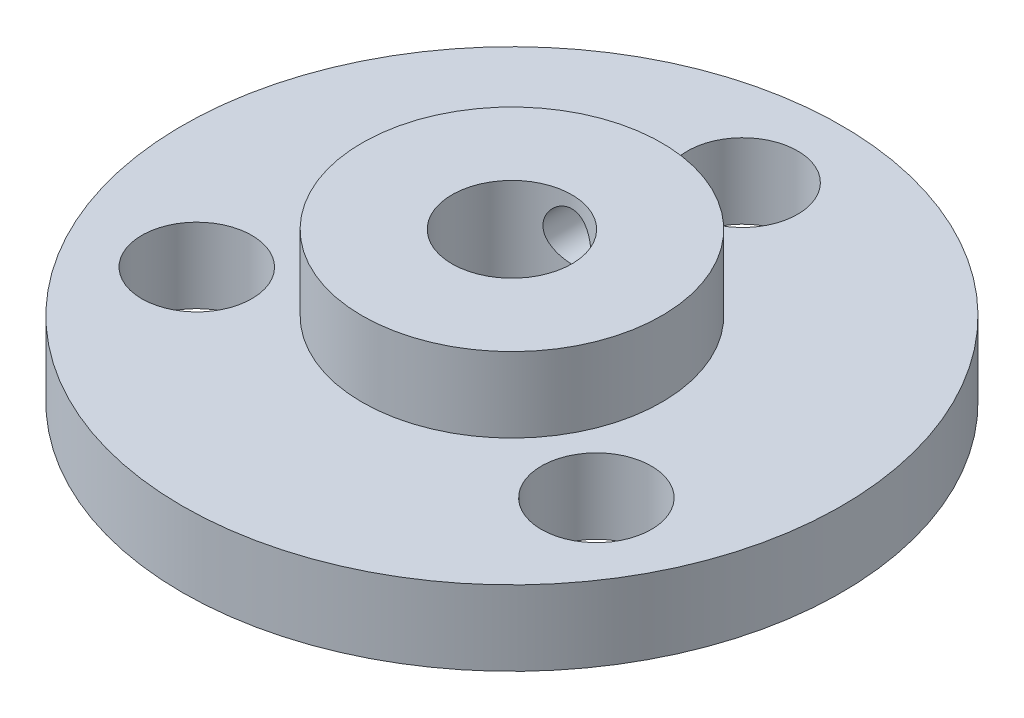
ISO-10303-21;
HEADER;
FILE_DESCRIPTION(('STEP AP214'),'2;1');
FILE_NAME('part.step','',(''),(''),'','','');
FILE_SCHEMA(('AUTOMOTIVE_DESIGN { 1 0 10303 214 1 1 1 1 }'));
ENDSEC;
DATA;
#1=APPLICATION_CONTEXT('core data for automotive mechanical design processes');
#2=APPLICATION_PROTOCOL_DEFINITION('international standard','automotive_design',2000,#1);
#3=PRODUCT_CONTEXT('',#1,'mechanical');
#4=PRODUCT('Part','Part','',(#3));
#5=PRODUCT_RELATED_PRODUCT_CATEGORY('part','',(#4));
#6=PRODUCT_DEFINITION_FORMATION('','',#4);
#7=PRODUCT_DEFINITION_CONTEXT('part definition',#1,'design');
#8=PRODUCT_DEFINITION('design','',#6,#7);
#9=PRODUCT_DEFINITION_SHAPE('','',#8);
#10=(LENGTH_UNIT() NAMED_UNIT(*) SI_UNIT(.MILLI.,.METRE.));
#11=(NAMED_UNIT(*) PLANE_ANGLE_UNIT() SI_UNIT($,.RADIAN.));
#12=(NAMED_UNIT(*) SI_UNIT($,.STERADIAN.) SOLID_ANGLE_UNIT());
#13=UNCERTAINTY_MEASURE_WITH_UNIT(LENGTH_MEASURE(1.E-05),#10,'distance_accuracy_value','');
#14=(GEOMETRIC_REPRESENTATION_CONTEXT(3) GLOBAL_UNCERTAINTY_ASSIGNED_CONTEXT((#13)) GLOBAL_UNIT_ASSIGNED_CONTEXT((#10,
#11,#12)) REPRESENTATION_CONTEXT('',''));
#15=CARTESIAN_POINT('',(0.,0.,0.));
#16=DIRECTION('',(0.,0.,1.));
#17=DIRECTION('',(1.,0.,0.));
#18=AXIS2_PLACEMENT_3D('',#15,#16,#17);
#19=CARTESIAN_POINT('',(0.,2.5,0.));
#20=DIRECTION('',(0.,1.,0.));
#21=DIRECTION('',(0.,0.,1.));
#22=AXIS2_PLACEMENT_3D('',#19,#20,#21);
#23=PLANE('',#22);
#24=CARTESIAN_POINT('',(0.,2.5,0.));
#25=DIRECTION('',(0.,1.,0.));
#26=DIRECTION('',(0.,0.,1.));
#27=AXIS2_PLACEMENT_3D('',#24,#25,#26);
#28=CIRCLE('',#27,11.);
#29=CARTESIAN_POINT('',(0.,2.5,11.));
#30=VERTEX_POINT('',#29);
#31=EDGE_CURVE('E10',#30,#30,#28,.T.);
#32=ORIENTED_EDGE('',*,*,#31,.T.);
#33=EDGE_LOOP('',(#32));
#34=FACE_BOUND('',#33,.T.);
#35=CARTESIAN_POINT('',(0.,2.5,-7.7));
#36=DIRECTION('',(0.,1.,0.));
#37=DIRECTION('',(0.,0.,1.));
#38=AXIS2_PLACEMENT_3D('',#35,#36,#37);
#39=CIRCLE('',#38,1.83552150537951);
#40=CARTESIAN_POINT('',(0.,2.5,-5.86447849462049));
#41=VERTEX_POINT('',#40);
#42=EDGE_CURVE('E44',#41,#41,#39,.T.);
#43=ORIENTED_EDGE('',*,*,#42,.F.);
#44=EDGE_LOOP('',(#43));
#45=FACE_BOUND('',#44,.T.);
#46=CARTESIAN_POINT('',(6.66839560914018,2.5,3.85));
#47=DIRECTION('',(0.,1.,0.));
#48=DIRECTION('',(0.,0.,1.));
#49=AXIS2_PLACEMENT_3D('',#46,#47,#48);
#50=CIRCLE('',#49,1.83552150537951);
#51=CARTESIAN_POINT('',(6.66839560914018,2.5,5.6855215053795));
#52=VERTEX_POINT('',#51);
#53=EDGE_CURVE('E50',#52,#52,#50,.T.);
#54=ORIENTED_EDGE('',*,*,#53,.F.);
#55=EDGE_LOOP('',(#54));
#56=FACE_BOUND('',#55,.T.);
#57=CARTESIAN_POINT('',(-6.66839560914018,2.5,3.85));
#58=DIRECTION('',(0.,1.,0.));
#59=DIRECTION('',(0.,0.,1.));
#60=AXIS2_PLACEMENT_3D('',#57,#58,#59);
#61=CIRCLE('',#60,1.83552150537951);
#62=CARTESIAN_POINT('',(-6.66839560914018,2.5,5.68552150537951));
#63=VERTEX_POINT('',#62);
#64=EDGE_CURVE('E56',#63,#63,#61,.T.);
#65=ORIENTED_EDGE('',*,*,#64,.F.);
#66=EDGE_LOOP('',(#65));
#67=FACE_BOUND('',#66,.T.);
#68=CARTESIAN_POINT('',(0.,2.5,0.));
#69=DIRECTION('',(0.,1.,0.));
#70=DIRECTION('',(0.,0.,1.));
#71=AXIS2_PLACEMENT_3D('',#68,#69,#70);
#72=CIRCLE('',#71,5.);
#73=CARTESIAN_POINT('',(0.,2.5,5.));
#74=VERTEX_POINT('',#73);
#75=EDGE_CURVE('E62',#74,#74,#72,.T.);
#76=ORIENTED_EDGE('',*,*,#75,.F.);
#77=EDGE_LOOP('',(#76));
#78=FACE_BOUND('',#77,.T.);
#79=ADVANCED_FACE('F31',(#34,#45,#56,#67,#78),#23,.T.);
#80=CARTESIAN_POINT('',(0.,2.5,0.));
#81=DIRECTION('',(0.,-1.,0.));
#82=DIRECTION('',(0.,0.,-1.));
#83=AXIS2_PLACEMENT_3D('',#80,#81,#82);
#84=CYLINDRICAL_SURFACE('',#83,11.);
#85=ORIENTED_EDGE('',*,*,#31,.F.);
#86=EDGE_LOOP('',(#85));
#87=FACE_BOUND('',#86,.T.);
#88=CARTESIAN_POINT('',(0.,0.,0.));
#89=DIRECTION('',(0.,1.,0.));
#90=DIRECTION('',(0.,0.,1.));
#91=AXIS2_PLACEMENT_3D('',#88,#89,#90);
#92=CIRCLE('',#91,11.);
#93=CARTESIAN_POINT('',(0.,0.,11.));
#94=VERTEX_POINT('',#93);
#95=EDGE_CURVE('E35',#94,#94,#92,.T.);
#96=ORIENTED_EDGE('',*,*,#95,.T.);
#97=EDGE_LOOP('',(#96));
#98=FACE_BOUND('',#97,.T.);
#99=ADVANCED_FACE('F33',(#87,#98),#84,.T.);
#100=CARTESIAN_POINT('',(0.,0.,0.));
#101=DIRECTION('',(0.,1.,0.));
#102=DIRECTION('',(0.,0.,1.));
#103=AXIS2_PLACEMENT_3D('',#100,#101,#102);
#104=PLANE('',#103);
#105=CARTESIAN_POINT('',(0.,0.,0.));
#106=DIRECTION('',(0.,1.,0.));
#107=DIRECTION('',(0.,0.,1.));
#108=AXIS2_PLACEMENT_3D('',#105,#106,#107);
#109=CIRCLE('',#108,2.);
#110=CARTESIAN_POINT('',(0.,0.,2.));
#111=VERTEX_POINT('',#110);
#112=EDGE_CURVE('E65',#111,#111,#109,.T.);
#113=ORIENTED_EDGE('',*,*,#112,.T.);
#114=EDGE_LOOP('',(#113));
#115=FACE_BOUND('',#114,.T.);
#116=CARTESIAN_POINT('',(-6.66839560914018,0.,3.85));
#117=DIRECTION('',(0.,1.,0.));
#118=DIRECTION('',(0.,0.,1.));
#119=AXIS2_PLACEMENT_3D('',#116,#117,#118);
#120=CIRCLE('',#119,1.83552150537951);
#121=CARTESIAN_POINT('',(-6.66839560914018,0.,5.68552150537951));
#122=VERTEX_POINT('',#121);
#123=EDGE_CURVE('E53',#122,#122,#120,.T.);
#124=ORIENTED_EDGE('',*,*,#123,.T.);
#125=EDGE_LOOP('',(#124));
#126=FACE_BOUND('',#125,.T.);
#127=CARTESIAN_POINT('',(6.66839560914018,0.,3.85));
#128=DIRECTION('',(0.,1.,0.));
#129=DIRECTION('',(0.,0.,1.));
#130=AXIS2_PLACEMENT_3D('',#127,#128,#129);
#131=CIRCLE('',#130,1.83552150537951);
#132=CARTESIAN_POINT('',(6.66839560914018,0.,5.6855215053795));
#133=VERTEX_POINT('',#132);
#134=EDGE_CURVE('E47',#133,#133,#131,.T.);
#135=ORIENTED_EDGE('',*,*,#134,.T.);
#136=EDGE_LOOP('',(#135));
#137=FACE_BOUND('',#136,.T.);
#138=CARTESIAN_POINT('',(0.,0.,-7.7));
#139=DIRECTION('',(0.,1.,0.));
#140=DIRECTION('',(0.,0.,1.));
#141=AXIS2_PLACEMENT_3D('',#138,#139,#140);
#142=CIRCLE('',#141,1.83552150537951);
#143=CARTESIAN_POINT('',(0.,0.,-5.86447849462049));
#144=VERTEX_POINT('',#143);
#145=EDGE_CURVE('E42',#144,#144,#142,.T.);
#146=ORIENTED_EDGE('',*,*,#145,.T.);
#147=EDGE_LOOP('',(#146));
#148=FACE_BOUND('',#147,.T.);
#149=ORIENTED_EDGE('',*,*,#95,.F.);
#150=EDGE_LOOP('',(#149));
#151=FACE_BOUND('',#150,.T.);
#152=ADVANCED_FACE('F113',(#115,#126,#137,#148,#151),#104,.F.);
#153=CARTESIAN_POINT('',(0.,0.,-7.7));
#154=DIRECTION('',(0.,1.,0.));
#155=DIRECTION('',(0.,0.,1.));
#156=AXIS2_PLACEMENT_3D('',#153,#154,#155);
#157=CYLINDRICAL_SURFACE('',#156,1.83552150537951);
#158=ORIENTED_EDGE('',*,*,#145,.F.);
#159=EDGE_LOOP('',(#158));
#160=FACE_BOUND('',#159,.T.);
#161=ORIENTED_EDGE('',*,*,#42,.T.);
#162=EDGE_LOOP('',(#161));
#163=FACE_BOUND('',#162,.T.);
#164=ADVANCED_FACE('F117',(#160,#163),#157,.F.);
#165=CARTESIAN_POINT('',(6.66839560914018,0.,3.85));
#166=DIRECTION('',(0.,1.,0.));
#167=DIRECTION('',(0.,0.,1.));
#168=AXIS2_PLACEMENT_3D('',#165,#166,#167);
#169=CYLINDRICAL_SURFACE('',#168,1.83552150537951);
#170=ORIENTED_EDGE('',*,*,#134,.F.);
#171=EDGE_LOOP('',(#170));
#172=FACE_BOUND('',#171,.T.);
#173=ORIENTED_EDGE('',*,*,#53,.T.);
#174=EDGE_LOOP('',(#173));
#175=FACE_BOUND('',#174,.T.);
#176=ADVANCED_FACE('F124',(#172,#175),#169,.F.);
#177=CARTESIAN_POINT('',(-6.66839560914018,0.,3.85));
#178=DIRECTION('',(0.,1.,0.));
#179=DIRECTION('',(0.,0.,1.));
#180=AXIS2_PLACEMENT_3D('',#177,#178,#179);
#181=CYLINDRICAL_SURFACE('',#180,1.83552150537951);
#182=ORIENTED_EDGE('',*,*,#123,.F.);
#183=EDGE_LOOP('',(#182));
#184=FACE_BOUND('',#183,.T.);
#185=ORIENTED_EDGE('',*,*,#64,.T.);
#186=EDGE_LOOP('',(#185));
#187=FACE_BOUND('',#186,.T.);
#188=ADVANCED_FACE('F104',(#184,#187),#181,.F.);
#189=CARTESIAN_POINT('',(0.,5.,0.));
#190=DIRECTION('',(0.,-1.,0.));
#191=DIRECTION('',(0.,0.,-1.));
#192=AXIS2_PLACEMENT_3D('',#189,#190,#191);
#193=CYLINDRICAL_SURFACE('',#192,5.);
#194=CARTESIAN_POINT('',(0.,4.59295521709407,-5.));
#195=CARTESIAN_POINT('',(-0.0446345464348313,4.59280840972482,-4.99999925421206));
#196=CARTESIAN_POINT('',(-0.0892819443510236,4.58891705369241,-4.9993960875234));
#197=CARTESIAN_POINT('',(-0.177301891678727,4.57375034444031,-4.99704993433986));
#198=CARTESIAN_POINT('',(-0.220673197606511,4.56246802289333,-4.99530587219164));
#199=CARTESIAN_POINT('',(-0.304854977903621,4.53286726162525,-4.99087558705497));
#200=CARTESIAN_POINT('',(-0.345667459361669,4.51455441889718,-4.98819011367073));
#201=CARTESIAN_POINT('',(-0.423635297501165,4.47142634078325,-4.98217463731942));
#202=CARTESIAN_POINT('',(-0.460791109846799,4.44661191698615,-4.97884471481213));
#203=CARTESIAN_POINT('',(-0.530725668288752,4.39095066663555,-4.97187860497349));
#204=CARTESIAN_POINT('',(-0.563467348194362,4.36005754142335,-4.96824019736804));
#205=CARTESIAN_POINT('',(-0.623325168104827,4.29321676146511,-4.96108624127247));
#206=CARTESIAN_POINT('',(-0.650440971001116,4.25726880404452,-4.95757070015512));
#207=CARTESIAN_POINT('',(-0.698418461816588,4.18109293926852,-4.95104061891818));
#208=CARTESIAN_POINT('',(-0.719244831066632,4.1408425198778,-4.94802894895029));
#209=CARTESIAN_POINT('',(-0.753826505269504,4.0573583918758,-4.9428790397377));
#210=CARTESIAN_POINT('',(-0.767582254949818,4.01412487108954,-4.94074074556118));
#211=CARTESIAN_POINT('',(-0.787517076477999,3.92629609351829,-4.93760253956309));
#212=CARTESIAN_POINT('',(-0.793760297058806,3.88171574712982,-4.93659299479914));
#213=CARTESIAN_POINT('',(-0.798690889447801,3.79212975820018,-4.93579776042976));
#214=CARTESIAN_POINT('',(-0.797378748811143,3.74712414328914,-4.9360119918528));
#215=CARTESIAN_POINT('',(-0.787288858704422,3.65841063797979,-4.93763113481972));
#216=CARTESIAN_POINT('',(-0.778581283745989,3.61469453280229,-4.93902485388638));
#217=CARTESIAN_POINT('',(-0.754056623447387,3.52935153996084,-4.94282826426096));
#218=CARTESIAN_POINT('',(-0.738239305621578,3.48772472066515,-4.94523798879167));
#219=CARTESIAN_POINT('',(-0.699868024192291,3.40752234623805,-4.95081411790351));
#220=CARTESIAN_POINT('',(-0.677283485215563,3.36896166684933,-4.95398394347471));
#221=CARTESIAN_POINT('',(-0.626041212269111,3.29614996590887,-4.9607195182505));
#222=CARTESIAN_POINT('',(-0.597383026549829,3.26189926522965,-4.96428529689616));
#223=CARTESIAN_POINT('',(-0.534418967683772,3.19827161328361,-4.97145948250141));
#224=CARTESIAN_POINT('',(-0.500052548802766,3.16895454552508,-4.97506791289197));
#225=CARTESIAN_POINT('',(-0.426855352339007,3.11649466439161,-4.98188150665978));
#226=CARTESIAN_POINT('',(-0.388024554815837,3.09335187859599,-4.98508666823568));
#227=CARTESIAN_POINT('',(-0.306953152851498,3.05389666610304,-4.99073439993172));
#228=CARTESIAN_POINT('',(-0.264710579067382,3.03758821841366,-4.99317652559617));
#229=CARTESIAN_POINT('',(-0.178038476907493,3.01231358506911,-4.99701733008075));
#230=CARTESIAN_POINT('',(-0.133609117789079,3.00334683211061,-4.99841608952256));
#231=CARTESIAN_POINT('',(-0.0443428342577001,2.99308885599946,-5.00000045238604));
#232=CARTESIAN_POINT('',(0.000484388161034169,2.99171513888676,-5.00019909658237));
#233=CARTESIAN_POINT('',(0.0897277032897241,2.99646392886732,-4.99939398406668));
#234=CARTESIAN_POINT('',(0.134143810122924,3.00258617747796,-4.99839026881552));
#235=CARTESIAN_POINT('',(0.221058825336589,3.02208504347062,-4.99529929653219));
#236=CARTESIAN_POINT('',(0.263566806501661,3.03542223188221,-4.99321793138338));
#237=CARTESIAN_POINT('',(0.345743289629186,3.06893109522977,-4.98820186778873));
#238=CARTESIAN_POINT('',(0.385411640694736,3.08910313304105,-4.98526712403657));
#239=CARTESIAN_POINT('',(0.461145134721012,3.13590295965188,-4.97883553280157));
#240=CARTESIAN_POINT('',(0.49717764390488,3.16258293348531,-4.97533422270727));
#241=CARTESIAN_POINT('',(0.564283089849037,3.22156791963512,-4.9681712513089));
#242=CARTESIAN_POINT('',(0.595355698403196,3.25387330390017,-4.9645095794138));
#243=CARTESIAN_POINT('',(0.651957795364863,3.3235577117943,-4.9573959412819));
#244=CARTESIAN_POINT('',(0.677432262603723,3.36098169719568,-4.95394627756548));
#245=CARTESIAN_POINT('',(0.721732833216668,3.43962673186726,-4.9476867714127));
#246=CARTESIAN_POINT('',(0.740559142226738,3.48084766364334,-4.94487690918741));
#247=CARTESIAN_POINT('',(0.770943170127823,3.56575058190925,-4.94023112007101));
#248=CARTESIAN_POINT('',(0.782530149288911,3.60942187342313,-4.93839127728325));
#249=CARTESIAN_POINT('',(0.79819980367199,3.69812236414841,-4.93588301608632));
#250=CARTESIAN_POINT('',(0.802283073557574,3.74315145546765,-4.93521450485016));
#251=CARTESIAN_POINT('',(0.802815962429541,3.83273817599765,-4.93512779371066));
#252=CARTESIAN_POINT('',(0.799352463469276,3.87729529912648,-4.93569536340789));
#253=CARTESIAN_POINT('',(0.78507589069214,3.96518430315666,-4.93798615841887));
#254=CARTESIAN_POINT('',(0.774262828172742,4.00851618594129,-4.93970938195619));
#255=CARTESIAN_POINT('',(0.745624187596046,4.09270216575181,-4.94411292837317));
#256=CARTESIAN_POINT('',(0.727804436540425,4.1335582892027,-4.94679245578731));
#257=CARTESIAN_POINT('',(0.685666554935631,4.21171525048427,-4.9528085340871));
#258=CARTESIAN_POINT('',(0.661348141854866,4.24901593364528,-4.95614511353666));
#259=CARTESIAN_POINT('',(0.606587081465107,4.3194447098727,-4.96314620762862));
#260=CARTESIAN_POINT('',(0.57608008604431,4.3525224588935,-4.9668139223735));
#261=CARTESIAN_POINT('',(0.509945409149719,4.41311877418437,-4.97403858748415));
#262=CARTESIAN_POINT('',(0.474316548786263,4.44063605709539,-4.97759551211962));
#263=CARTESIAN_POINT('',(0.398688189514482,4.48948390134341,-4.98422474154444));
#264=CARTESIAN_POINT('',(0.358663017320111,4.51077513877548,-4.98729391237595));
#265=CARTESIAN_POINT('',(0.275572401990428,4.54629917536374,-4.99257309312883));
#266=CARTESIAN_POINT('',(0.232510090751464,4.56053912765659,-4.9947839732444));
#267=CARTESIAN_POINT('',(0.157722389070857,4.57841711433274,-4.99760747858701));
#268=CARTESIAN_POINT('',(0.126447109545309,4.58395060419822,-4.99850013479712));
#269=CARTESIAN_POINT('',(0.0634500468027397,4.59127180597416,-4.99969665612681));
#270=CARTESIAN_POINT('',(0.0317282703374389,4.59305957446456,-5.00000053014007));
#271=CARTESIAN_POINT('',(0.,4.59295521709407,-5.));
#272=B_SPLINE_CURVE_WITH_KNOTS('',3,(#194,#195,#196,#197,#198,#199,#200,#201,#202,#203,#204,
#205,#206,#207,#208,#209,#210,#211,#212,#213,#214,#215,#216,#217,#218,#219,#220,#221,#222,#223,
#224,#225,#226,#227,#228,#229,#230,#231,#232,#233,#234,#235,#236,#237,#238,#239,#240,#241,#242,
#243,#244,#245,#246,#247,#248,#249,#250,#251,#252,#253,#254,#255,#256,#257,#258,#259,#260,#261,
#262,#263,#264,#265,#266,#267,#268,#269,#270,#271),.UNSPECIFIED.,.T.,.F.,(4,2,2,2,2,2,2,2,2,2,2,
2,2,2,2,2,2,2,2,2,2,2,2,2,2,2,2,2,2,2,2,2,2,2,2,2,2,2,4),(0.,0.133788385130539,
0.267703090104946,0.401511406008692,0.535303026646016,0.670156140567426,0.805017332699408,
0.940622335585652,1.07621880815101,1.21064902767122,1.34507057236968,1.47823067492862,
1.61139513208442,1.7451705597479,1.87895594093932,2.01426343587848,2.14957153520019,
2.28495830293327,2.42033460814823,2.55423719337488,2.68813516138254,2.82130867464517,
2.95448925945418,3.08877506801445,3.22306975884365,3.3586305509906,3.49418714970257,
3.62919224330303,3.7641866373849,3.8976351294267,4.03108341633699,4.16442095702508,
4.29776429555247,4.43257259927336,4.56741198138658,4.70308547687105,4.83862105572563,
4.933725375399,5.02882825849044),.UNSPECIFIED.);
#273=CARTESIAN_POINT('',(0.,4.59295521709407,-5.));
#274=VERTEX_POINT('',#273);
#275=EDGE_CURVE('E73',#274,#274,#272,.T.);
#276=ORIENTED_EDGE('',*,*,#275,.T.);
#277=EDGE_LOOP('',(#276));
#278=FACE_BOUND('',#277,.T.);
#279=CARTESIAN_POINT('',(0.,5.,0.));
#280=DIRECTION('',(0.,1.,0.));
#281=DIRECTION('',(0.,0.,1.));
#282=AXIS2_PLACEMENT_3D('',#279,#280,#281);
#283=CIRCLE('',#282,5.);
#284=CARTESIAN_POINT('',(0.,5.,5.));
#285=VERTEX_POINT('',#284);
#286=EDGE_CURVE('E59',#285,#285,#283,.T.);
#287=ORIENTED_EDGE('',*,*,#286,.F.);
#288=EDGE_LOOP('',(#287));
#289=FACE_BOUND('',#288,.T.);
#290=ORIENTED_EDGE('',*,*,#75,.T.);
#291=EDGE_LOOP('',(#290));
#292=FACE_BOUND('',#291,.T.);
#293=ADVANCED_FACE('F84',(#278,#289,#292),#193,.T.);
#294=CARTESIAN_POINT('',(0.,5.,0.));
#295=DIRECTION('',(0.,1.,0.));
#296=DIRECTION('',(0.,0.,1.));
#297=AXIS2_PLACEMENT_3D('',#294,#295,#296);
#298=PLANE('',#297);
#299=CARTESIAN_POINT('',(0.,5.,0.));
#300=DIRECTION('',(0.,1.,0.));
#301=DIRECTION('',(0.,0.,1.));
#302=AXIS2_PLACEMENT_3D('',#299,#300,#301);
#303=CIRCLE('',#302,2.);
#304=CARTESIAN_POINT('',(0.,5.,2.));
#305=VERTEX_POINT('',#304);
#306=EDGE_CURVE('E70',#305,#305,#303,.T.);
#307=ORIENTED_EDGE('',*,*,#306,.F.);
#308=EDGE_LOOP('',(#307));
#309=FACE_BOUND('',#308,.T.);
#310=ORIENTED_EDGE('',*,*,#286,.T.);
#311=EDGE_LOOP('',(#310));
#312=FACE_BOUND('',#311,.T.);
#313=ADVANCED_FACE('F97',(#309,#312),#298,.T.);
#314=CARTESIAN_POINT('',(0.,-0.5,0.));
#315=DIRECTION('',(0.,1.,0.));
#316=DIRECTION('',(0.,0.,1.));
#317=AXIS2_PLACEMENT_3D('',#314,#315,#316);
#318=CYLINDRICAL_SURFACE('',#317,2.);
#319=CARTESIAN_POINT('',(-0.799047163232813,3.79295943814312,-1.83344583528655));
#320=CARTESIAN_POINT('',(-0.799042462665124,3.83581523738308,-1.83345016148734));
#321=CARTESIAN_POINT('',(-0.795582298961543,3.878731652025,-1.83496816656248));
#322=CARTESIAN_POINT('',(-0.781870924640436,3.96333337129395,-1.84085028760058));
#323=CARTESIAN_POINT('',(-0.77160236073739,4.00501524497531,-1.84522167583811));
#324=CARTESIAN_POINT('',(-0.74472932715532,4.08578061493114,-1.85622915151899));
#325=CARTESIAN_POINT('',(-0.728148728191176,4.12487325708722,-1.86285669680965));
#326=CARTESIAN_POINT('',(-0.689192297844292,4.19971345848696,-1.87761712591289));
#327=CARTESIAN_POINT('',(-0.666817731835187,4.23546174580346,-1.88574968092829));
#328=CARTESIAN_POINT('',(-0.615539712811226,4.3046635990397,-1.90312364779918));
#329=CARTESIAN_POINT('',(-0.586357840324346,4.3379020073149,-1.91240069322624));
#330=CARTESIAN_POINT('',(-0.522880208430889,4.39917103706927,-1.93072185889342));
#331=CARTESIAN_POINT('',(-0.488582669464801,4.42719983865906,-1.93976589678943));
#332=CARTESIAN_POINT('',(-0.414185402195356,4.4783219969362,-1.95702917136805));
#333=CARTESIAN_POINT('',(-0.373910211072263,4.50117715873137,-1.96520182230166));
#334=CARTESIAN_POINT('',(-0.289701380398091,4.53969686549904,-1.97936655195159));
#335=CARTESIAN_POINT('',(-0.245769238148498,4.55536433645589,-1.9853595177737));
#336=CARTESIAN_POINT('',(-0.15775007590205,4.57829603271807,-1.99423556096864));
#337=CARTESIAN_POINT('',(-0.113773523697688,4.58593036377872,-1.99725515136257));
#338=CARTESIAN_POINT('',(-0.0250668487170979,4.59377083240819,-2.00033454157052));
#339=CARTESIAN_POINT('',(0.0196629867650228,4.59397974051705,-2.00039544531936));
#340=CARTESIAN_POINT('',(0.105931294208234,4.58716633023312,-1.99763306267521));
#341=CARTESIAN_POINT('',(0.147507899770071,4.58054952904434,-1.99497158842065));
#342=CARTESIAN_POINT('',(0.228902174751904,4.56096228761881,-1.98727846099662));
#343=CARTESIAN_POINT('',(0.268719714875986,4.54799138118296,-1.98224663391601));
#344=CARTESIAN_POINT('',(0.346183249643453,4.51590484499259,-1.97020763308979));
#345=CARTESIAN_POINT('',(0.383787471768837,4.4966995522169,-1.96317183115119));
#346=CARTESIAN_POINT('',(0.455335714177721,4.45277343537551,-1.94782194029242));
#347=CARTESIAN_POINT('',(0.489278474026519,4.42805072090407,-1.93950741355362));
#348=CARTESIAN_POINT('',(0.554906472629291,4.37189978376448,-1.92179839226061));
#349=CARTESIAN_POINT('',(0.586297182710696,4.34013788110958,-1.91236883284082));
#350=CARTESIAN_POINT('',(0.643427425666812,4.27176320941473,-1.89391247433249));
#351=CARTESIAN_POINT('',(0.669165108827847,4.23514885888145,-1.88488580784112));
#352=CARTESIAN_POINT('',(0.714932684947921,4.15679182917954,-1.86801625144648));
#353=CARTESIAN_POINT('',(0.734780817558311,4.11493350594959,-1.86021400116245));
#354=CARTESIAN_POINT('',(0.767030676121984,4.02807324195831,-1.84715194248047));
#355=CARTESIAN_POINT('',(0.779437238497364,3.98307336423478,-1.8418904832071));
#356=CARTESIAN_POINT('',(0.795735790485007,3.8941451271687,-1.83490569798837));
#357=CARTESIAN_POINT('',(0.800101652415489,3.85031925929505,-1.83298585564763));
#358=CARTESIAN_POINT('',(0.801577009622707,3.76252855503594,-1.83234161445076));
#359=CARTESIAN_POINT('',(0.798688705387972,3.71856376483198,-1.83361624657819));
#360=CARTESIAN_POINT('',(0.786169103831115,3.63437586416117,-1.83901580962576));
#361=CARTESIAN_POINT('',(0.776931226908903,3.59408226318332,-1.84297426536608));
#362=CARTESIAN_POINT('',(0.752484930936952,3.51564407622872,-1.85308934576475));
#363=CARTESIAN_POINT('',(0.737275188035641,3.4774999689002,-1.85924645779688));
#364=CARTESIAN_POINT('',(0.700628046591321,3.40271849502493,-1.8733712247657));
#365=CARTESIAN_POINT('',(0.678963109315047,3.36620496266534,-1.88140217745099));
#366=CARTESIAN_POINT('',(0.630252814553532,3.29716624316646,-1.89827421927866));
#367=CARTESIAN_POINT('',(0.603205265897451,3.26464268902489,-1.9071156375548));
#368=CARTESIAN_POINT('',(0.542138497452119,3.20201007470344,-1.9254021441529));
#369=CARTESIAN_POINT('',(0.507751887159069,3.17225681202671,-1.93484358333461));
#370=CARTESIAN_POINT('',(0.434248415737526,3.11888860749899,-1.95265373874898));
#371=CARTESIAN_POINT('',(0.395131362162263,3.09527391550423,-1.96102241131014));
#372=CARTESIAN_POINT('',(0.313138935684557,3.05494038755864,-1.97577237459626));
#373=CARTESIAN_POINT('',(0.270264465652488,3.03821990047681,-1.98215414108649));
#374=CARTESIAN_POINT('',(0.181992917293085,3.01233989718007,-1.99219653103666));
#375=CARTESIAN_POINT('',(0.136597222310326,3.0031762775671,-1.9958586311747));
#376=CARTESIAN_POINT('',(0.0477660664283565,2.99315755749297,-1.99989147626839));
#377=CARTESIAN_POINT('',(0.00439594967590211,2.99179938675807,-2.0004613723665));
#378=CARTESIAN_POINT('',(-0.0819346635675842,2.99610162985677,-1.99878702553996));
#379=CARTESIAN_POINT('',(-0.124895221072546,3.00176098125737,-1.99654320860292));
#380=CARTESIAN_POINT('',(-0.207834285010329,3.01957815348652,-1.98959434533991));
#381=CARTESIAN_POINT('',(-0.247863856579021,3.03153101657335,-1.98496701941007));
#382=CARTESIAN_POINT('',(-0.325343117641275,3.06138055996786,-1.97374915700592));
#383=CARTESIAN_POINT('',(-0.362792329762863,3.07927833655126,-1.96715825846082));
#384=CARTESIAN_POINT('',(-0.43586655616293,3.12140071753886,-1.95229918545447));
#385=CARTESIAN_POINT('',(-0.471337828202994,3.14586995609716,-1.94396976221287));
#386=CARTESIAN_POINT('',(-0.537820302467067,3.2000748458147,-1.9266374083776));
#387=CARTESIAN_POINT('',(-0.568829649016988,3.22981267672717,-1.91763419991543));
#388=CARTESIAN_POINT('',(-0.627493429707883,3.29588552795315,-1.89927745433076));
#389=CARTESIAN_POINT('',(-0.654821337141409,3.33251498750357,-1.88993673310011));
#390=CARTESIAN_POINT('',(-0.702965798364044,3.41013629311463,-1.8725643096112));
#391=CARTESIAN_POINT('',(-0.723781586606334,3.45112865130707,-1.86453276130883));
#392=CARTESIAN_POINT('',(-0.756634245727271,3.53257431888235,-1.85142897319136));
#393=CARTESIAN_POINT('',(-0.769291558814073,3.57274553204359,-1.84615576781002));
#394=CARTESIAN_POINT('',(-0.788131797050594,3.65475360599526,-1.83819389903301));
#395=CARTESIAN_POINT('',(-0.794332763107589,3.69658548452991,-1.83549803553179));
#396=CARTESIAN_POINT('',(-0.798432727575443,3.75671046307829,-1.83371307301416));
#397=CARTESIAN_POINT('',(-0.799049151782278,3.77482952654216,-1.83344400511096));
#398=CARTESIAN_POINT('',(-0.799047163232813,3.79295943814312,-1.83344583528655));
#399=B_SPLINE_CURVE_WITH_KNOTS('',3,(#319,#320,#321,#322,#323,#324,#325,#326,#327,#328,#329,
#330,#331,#332,#333,#334,#335,#336,#337,#338,#339,#340,#341,#342,#343,#344,#345,#346,#347,#348,
#349,#350,#351,#352,#353,#354,#355,#356,#357,#358,#359,#360,#361,#362,#363,#364,#365,#366,#367,
#368,#369,#370,#371,#372,#373,#374,#375,#376,#377,#378,#379,#380,#381,#382,#383,#384,#385,#386,
#387,#388,#389,#390,#391,#392,#393,#394,#395,#396,#397,#398),.UNSPECIFIED.,.T.,.F.,(4,2,2,2,2,2,
2,2,2,2,2,2,2,2,2,2,2,2,2,2,2,2,2,2,2,2,2,2,2,2,2,2,2,2,2,2,2,2,2,4),(0.,0.128511059507061,
0.257350934328896,0.385708329317353,0.514037715295441,0.649022473137693,0.784054297393363,
0.924410676365705,1.06470986787791,1.19821673154872,1.33167378122268,1.4576345793212,
1.58360462051623,1.71147320093958,1.83938565976011,1.97569617632541,2.11205122850849,
2.25225783485829,2.39237321917643,2.5239285900737,2.65544405960778,2.7794689923166,
2.90352143458257,3.03260461858682,3.16174045807941,3.30041493696393,3.439095059387,
3.57774194922726,3.71631350379256,3.84584415899982,3.97535520602642,4.10088797774942,
4.22644391129035,4.35754820453571,4.48870686623283,4.62798501311846,4.76727952701276,
4.89406664325231,5.02049852085298,5.07486442208289),.UNSPECIFIED.);
#400=CARTESIAN_POINT('',(-0.799047163232813,3.79295943814312,-1.83344583528655));
#401=VERTEX_POINT('',#400);
#402=EDGE_CURVE('E80',#401,#401,#399,.T.);
#403=ORIENTED_EDGE('',*,*,#402,.T.);
#404=EDGE_LOOP('',(#403));
#405=FACE_BOUND('',#404,.T.);
#406=ORIENTED_EDGE('',*,*,#306,.T.);
#407=EDGE_LOOP('',(#406));
#408=FACE_BOUND('',#407,.T.);
#409=ORIENTED_EDGE('',*,*,#112,.F.);
#410=EDGE_LOOP('',(#409));
#411=FACE_BOUND('',#410,.T.);
#412=ADVANCED_FACE('F91',(#405,#408,#411),#318,.F.);
#413=CARTESIAN_POINT('',(0.002598780609484,3.79295943814312,-4.99999932463389));
#414=DIRECTION('',(0.000519756121896799,0.,-0.999999864926778));
#415=DIRECTION('',(-0.999999864926778,0.,-0.000519756121896799));
#416=AXIS2_PLACEMENT_3D('',#413,#414,#415);
#417=CYLINDRICAL_SURFACE('',#416,0.799999999999994);
#418=ORIENTED_EDGE('',*,*,#402,.F.);
#419=EDGE_LOOP('',(#418));
#420=FACE_BOUND('',#419,.T.);
#421=ORIENTED_EDGE('',*,*,#275,.F.);
#422=EDGE_LOOP('',(#421));
#423=FACE_BOUND('',#422,.T.);
#424=ADVANCED_FACE('F88',(#420,#423),#417,.F.);
#425=CLOSED_SHELL('',(#79,#99,#152,#164,#176,#188,#293,#313,#412,#424));
#426=MANIFOLD_SOLID_BREP('B2',#425);
#427=ADVANCED_BREP_SHAPE_REPRESENTATION('',(#18,#426),#14);
#428=SHAPE_DEFINITION_REPRESENTATION(#9,#427);
ENDSEC;
END-ISO-10303-21;
